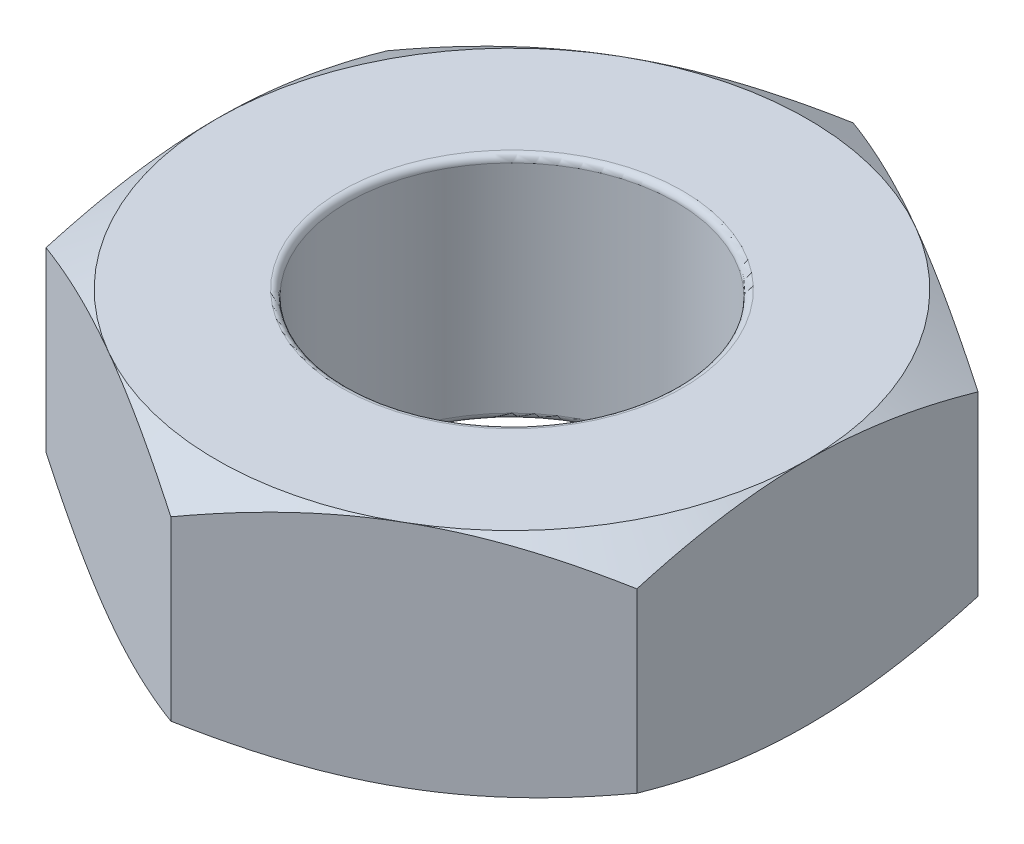
ISO-10303-21;
HEADER;
FILE_DESCRIPTION(('STEP AP214'),'2;1');
FILE_NAME('part.step','',(''),(''),'','','');
FILE_SCHEMA(('AUTOMOTIVE_DESIGN { 1 0 10303 214 1 1 1 1 }'));
ENDSEC;
DATA;
#1=APPLICATION_CONTEXT('core data for automotive mechanical design processes');
#2=APPLICATION_PROTOCOL_DEFINITION('international standard','automotive_design',2000,#1);
#3=PRODUCT_CONTEXT('',#1,'mechanical');
#4=PRODUCT('Part','Part','',(#3));
#5=PRODUCT_RELATED_PRODUCT_CATEGORY('part','',(#4));
#6=PRODUCT_DEFINITION_FORMATION('','',#4);
#7=PRODUCT_DEFINITION_CONTEXT('part definition',#1,'design');
#8=PRODUCT_DEFINITION('design','',#6,#7);
#9=PRODUCT_DEFINITION_SHAPE('','',#8);
#10=(LENGTH_UNIT() NAMED_UNIT(*) SI_UNIT(.MILLI.,.METRE.));
#11=(NAMED_UNIT(*) PLANE_ANGLE_UNIT() SI_UNIT($,.RADIAN.));
#12=(NAMED_UNIT(*) SI_UNIT($,.STERADIAN.) SOLID_ANGLE_UNIT());
#13=UNCERTAINTY_MEASURE_WITH_UNIT(LENGTH_MEASURE(1.E-05),#10,'distance_accuracy_value','');
#14=(GEOMETRIC_REPRESENTATION_CONTEXT(3) GLOBAL_UNCERTAINTY_ASSIGNED_CONTEXT((#13)) GLOBAL_UNIT_ASSIGNED_CONTEXT((#10,
#11,#12)) REPRESENTATION_CONTEXT('',''));
#15=CARTESIAN_POINT('',(0.,0.,0.));
#16=DIRECTION('',(0.,0.,1.));
#17=DIRECTION('',(1.,0.,0.));
#18=AXIS2_PLACEMENT_3D('',#15,#16,#17);
#19=CARTESIAN_POINT('',(2.25,1.75,-1.29903810567666));
#20=DIRECTION('',(-0.5,0.,0.866025403784439));
#21=DIRECTION('',(0.866025403784439,0.,0.5));
#22=AXIS2_PLACEMENT_3D('',#19,#20,#21);
#23=PLANE('',#22);
#24=CARTESIAN_POINT('',(-0.000200000000000445,0.201028565434254,-2.59819168140715));
#25=CARTESIAN_POINT('',(0.0986772488143566,0.168055578047864,-2.54110487518745));
#26=CARTESIAN_POINT('',(0.198407997179093,0.138067535415598,-2.48352530077259));
#27=CARTESIAN_POINT('',(0.399596540220632,0.0857223882308776,-2.36736904128969));
#28=CARTESIAN_POINT('',(0.501057910502945,0.0633838027064783,-2.30879029184485));
#29=CARTESIAN_POINT('',(0.702723189801078,0.0286095576734186,-2.19235878855587));
#30=CARTESIAN_POINT('',(0.802896064976671,0.0159424738337182,-2.13452395210774));
#31=CARTESIAN_POINT('',(1.00371331260268,0.00081890741741877,-2.01858206013295));
#32=CARTESIAN_POINT('',(1.1043569548332,-0.00165009697600177,-1.96047542619893));
#33=CARTESIAN_POINT('',(1.29242516452656,0.00347837463602896,-1.85189419470646));
#34=CARTESIAN_POINT('',(1.37987784389126,0.00981663451512003,-1.8014033667339));
#35=CARTESIAN_POINT('',(1.55421343210877,0.0299076571898887,-1.70075066794718));
#36=CARTESIAN_POINT('',(1.64109573768829,0.0436672872310832,-1.65058914543304));
#37=CARTESIAN_POINT('',(1.81579095410173,0.078066265350665,-1.54972881521059));
#38=CARTESIAN_POINT('',(1.90358174743525,0.0988514715826551,-1.49904277704711));
#39=CARTESIAN_POINT('',(2.07785373687759,0.146026087362979,-1.39842679703037));
#40=CARTESIAN_POINT('',(2.164337166751,0.172404408014301,-1.34849556551251));
#41=CARTESIAN_POINT('',(2.2502,0.201028565434254,-1.29892263562282));
#42=B_SPLINE_CURVE_WITH_KNOTS('',3,(#24,#25,#26,#27,#28,#29,#30,#31,#32,#33,#34,#35,#36,#37,#38,
#39,#40,#41),.UNSPECIFIED.,.F.,.F.,(4,2,2,2,2,2,2,2,4),(0.,0.356658826016552,0.714175103224236,
1.06284241804968,1.41108149062515,1.71433394539793,2.01786749258222,2.32813511279245,
2.63779325460359),.UNSPECIFIED.);
#43=CARTESIAN_POINT('',(0.,0.200961894323341,-2.59807621135332));
#44=VERTEX_POINT('',#43);
#45=CARTESIAN_POINT('',(1.125,0.,-1.94855715851499));
#46=VERTEX_POINT('',#45);
#47=EDGE_CURVE('E63',#44,#46,#42,.T.);
#48=ORIENTED_EDGE('',*,*,#47,.F.);
#49=DIRECTION('',(0.,-1.,0.));
#50=VECTOR('',#49,1.);
#51=CARTESIAN_POINT('',(0.,1.75,-2.59807621135332));
#52=LINE('',#51,#50);
#53=CARTESIAN_POINT('',(0.,1.54903810567666,-2.59807621135332));
#54=VERTEX_POINT('',#53);
#55=EDGE_CURVE('E346',#54,#44,#52,.T.);
#56=ORIENTED_EDGE('',*,*,#55,.F.);
#57=CARTESIAN_POINT('',(2.2502,1.54897143456575,-1.29892263562282));
#58=CARTESIAN_POINT('',(2.15132275118564,1.58194442195214,-1.35600944184252));
#59=CARTESIAN_POINT('',(2.0515920028209,1.6119324645844,-1.41358901625738));
#60=CARTESIAN_POINT('',(1.85040345977937,1.66427761176912,-1.52974527574028));
#61=CARTESIAN_POINT('',(1.74894208949705,1.68661619729352,-1.58832402518513));
#62=CARTESIAN_POINT('',(1.54727681019892,1.72139044232658,-1.7047555284741));
#63=CARTESIAN_POINT('',(1.44710393502333,1.73405752616628,-1.76259036492223));
#64=CARTESIAN_POINT('',(1.24628668739732,1.74918109258258,-1.87853225689703));
#65=CARTESIAN_POINT('',(1.1456430451668,1.751650096976,-1.93663889083104));
#66=CARTESIAN_POINT('',(0.957574835473434,1.74652162536397,-2.04522012232352));
#67=CARTESIAN_POINT('',(0.87012215610874,1.74018336548488,-2.09571095029608));
#68=CARTESIAN_POINT('',(0.695786567891225,1.72009234281011,-2.19636364908279));
#69=CARTESIAN_POINT('',(0.608904262311711,1.70633271276892,-2.24652517159694));
#70=CARTESIAN_POINT('',(0.434209045898263,1.67193373464933,-2.34738550181938));
#71=CARTESIAN_POINT('',(0.346418252564746,1.65114852841734,-2.39807153998286));
#72=CARTESIAN_POINT('',(0.172146263122404,1.60397391263702,-2.49868751999961));
#73=CARTESIAN_POINT('',(0.085662833248997,1.5775955919857,-2.54861875151746));
#74=CARTESIAN_POINT('',(-0.00020000000000065,1.54897143456575,-2.59819168140715));
#75=B_SPLINE_CURVE_WITH_KNOTS('',3,(#57,#58,#59,#60,#61,#62,#63,#64,#65,#66,#67,#68,#69,#70,#71,
#72,#73,#74),.UNSPECIFIED.,.F.,.F.,(4,2,2,2,2,2,2,2,4),(0.,0.356658826016552,0.714175103224236,
1.06284241804968,1.41108149062516,1.71433394539794,2.01786749258222,2.32813511279245,
2.63779325460359),.UNSPECIFIED.);
#76=CARTESIAN_POINT('',(1.125,1.75,-1.94855715851499));
#77=VERTEX_POINT('',#76);
#78=EDGE_CURVE('E278',#77,#54,#75,.T.);
#79=ORIENTED_EDGE('',*,*,#78,.F.);
#80=CARTESIAN_POINT('',(2.25,1.54903810567667,-1.29903810567667));
#81=VERTEX_POINT('',#80);
#82=EDGE_CURVE('E365',#81,#77,#75,.T.);
#83=ORIENTED_EDGE('',*,*,#82,.F.);
#84=DIRECTION('',(0.,-1.,0.));
#85=VECTOR('',#84,1.);
#86=CARTESIAN_POINT('',(2.25,1.75,-1.29903810567666));
#87=LINE('',#86,#85);
#88=CARTESIAN_POINT('',(2.25,0.200961894323341,-1.29903810567666));
#89=VERTEX_POINT('',#88);
#90=EDGE_CURVE('E362',#81,#89,#87,.T.);
#91=ORIENTED_EDGE('',*,*,#90,.T.);
#92=EDGE_CURVE('E151',#46,#89,#42,.T.);
#93=ORIENTED_EDGE('',*,*,#92,.F.);
#94=EDGE_LOOP('',(#48,#56,#79,#83,#91,#93));
#95=FACE_BOUND('',#94,.T.);
#96=ADVANCED_FACE('F47',(#95),#23,.F.);
#97=CARTESIAN_POINT('',(0.,1.75,-2.59807621135332));
#98=DIRECTION('',(0.5,0.,0.866025403784439));
#99=DIRECTION('',(0.866025403784439,0.,-0.5));
#100=AXIS2_PLACEMENT_3D('',#97,#98,#99);
#101=PLANE('',#100);
#102=CARTESIAN_POINT('',(-2.2502,0.201028565434254,-1.29892263562282));
#103=CARTESIAN_POINT('',(-2.15132275118564,0.168055578047864,-1.35600944184252));
#104=CARTESIAN_POINT('',(-2.05159200282091,0.138067535415598,-1.41358901625738));
#105=CARTESIAN_POINT('',(-1.85040345977937,0.0857223882308778,-1.52974527574028));
#106=CARTESIAN_POINT('',(-1.74894208949705,0.0633838027064785,-1.58832402518512));
#107=CARTESIAN_POINT('',(-1.54727681019892,0.0286095576734186,-1.7047555284741));
#108=CARTESIAN_POINT('',(-1.44710393502333,0.0159424738337181,-1.76259036492223));
#109=CARTESIAN_POINT('',(-1.24628668739732,0.00081890741741863,-1.87853225689702));
#110=CARTESIAN_POINT('',(-1.1456430451668,-0.00165009697600174,-1.93663889083104));
#111=CARTESIAN_POINT('',(-0.957574835473435,0.00347837463602905,-2.04522012232352));
#112=CARTESIAN_POINT('',(-0.870122156108742,0.00981663451512006,-2.09571095029608));
#113=CARTESIAN_POINT('',(-0.695786567891226,0.0299076571898888,-2.19636364908279));
#114=CARTESIAN_POINT('',(-0.608904262311712,0.0436672872310833,-2.24652517159694));
#115=CARTESIAN_POINT('',(-0.434209045898264,0.0780662653506652,-2.34738550181938));
#116=CARTESIAN_POINT('',(-0.346418252564747,0.0988514715826553,-2.39807153998286));
#117=CARTESIAN_POINT('',(-0.172146263122405,0.146026087362979,-2.49868751999961));
#118=CARTESIAN_POINT('',(-0.0856628332489981,0.172404408014302,-2.54861875151746));
#119=CARTESIAN_POINT('',(0.00019999999999954,0.201028565434254,-2.59819168140715));
#120=B_SPLINE_CURVE_WITH_KNOTS('',3,(#102,#103,#104,#105,#106,#107,#108,#109,#110,#111,#112,
#113,#114,#115,#116,#117,#118,#119),.UNSPECIFIED.,.F.,.F.,(4,2,2,2,2,2,2,2,4),(0.,
0.356658826016552,0.714175103224236,1.06284241804968,1.41108149062516,1.71433394539794,
2.01786749258222,2.32813511279245,2.63779325460359),.UNSPECIFIED.);
#121=CARTESIAN_POINT('',(-2.25,0.200961894323341,-1.29903810567666));
#122=VERTEX_POINT('',#121);
#123=CARTESIAN_POINT('',(-1.125,0.,-1.94855715851499));
#124=VERTEX_POINT('',#123);
#125=EDGE_CURVE('E71',#122,#124,#120,.T.);
#126=ORIENTED_EDGE('',*,*,#125,.F.);
#127=DIRECTION('',(0.,-1.,0.));
#128=VECTOR('',#127,1.);
#129=CARTESIAN_POINT('',(-2.25,1.75,-1.29903810567666));
#130=LINE('',#129,#128);
#131=CARTESIAN_POINT('',(-2.25,1.54903810567666,-1.29903810567666));
#132=VERTEX_POINT('',#131);
#133=EDGE_CURVE('E350',#132,#122,#130,.T.);
#134=ORIENTED_EDGE('',*,*,#133,.F.);
#135=CARTESIAN_POINT('',(0.0001999999999996,1.54897143456575,-2.59819168140715));
#136=CARTESIAN_POINT('',(-0.0986772488143576,1.58194442195214,-2.54110487518745));
#137=CARTESIAN_POINT('',(-0.198407997179094,1.6119324645844,-2.48352530077259));
#138=CARTESIAN_POINT('',(-0.399596540220633,1.66427761176912,-2.36736904128969));
#139=CARTESIAN_POINT('',(-0.501057910502946,1.68661619729352,-2.30879029184485));
#140=CARTESIAN_POINT('',(-0.702723189801079,1.72139044232658,-2.19235878855587));
#141=CARTESIAN_POINT('',(-0.802896064976672,1.73405752616628,-2.13452395210774));
#142=CARTESIAN_POINT('',(-1.00371331260268,1.74918109258258,-2.01858206013295));
#143=CARTESIAN_POINT('',(-1.1043569548332,1.751650096976,-1.96047542619893));
#144=CARTESIAN_POINT('',(-1.29242516452656,1.74652162536397,-1.85189419470646));
#145=CARTESIAN_POINT('',(-1.37987784389126,1.74018336548488,-1.8014033667339));
#146=CARTESIAN_POINT('',(-1.55421343210877,1.72009234281011,-1.70075066794718));
#147=CARTESIAN_POINT('',(-1.64109573768829,1.70633271276892,-1.65058914543304));
#148=CARTESIAN_POINT('',(-1.81579095410174,1.67193373464933,-1.54972881521059));
#149=CARTESIAN_POINT('',(-1.90358174743525,1.65114852841734,-1.49904277704711));
#150=CARTESIAN_POINT('',(-2.0778537368776,1.60397391263702,-1.39842679703037));
#151=CARTESIAN_POINT('',(-2.164337166751,1.5775955919857,-1.34849556551251));
#152=CARTESIAN_POINT('',(-2.2502,1.54897143456575,-1.29892263562282));
#153=B_SPLINE_CURVE_WITH_KNOTS('',3,(#135,#136,#137,#138,#139,#140,#141,#142,#143,#144,#145,
#146,#147,#148,#149,#150,#151,#152),.UNSPECIFIED.,.F.,.F.,(4,2,2,2,2,2,2,2,4),(0.,
0.356658826016552,0.714175103224236,1.06284241804968,1.41108149062516,1.71433394539794,
2.01786749258222,2.32813511279245,2.63779325460359),.UNSPECIFIED.);
#154=CARTESIAN_POINT('',(-1.125,1.75,-1.94855715851499));
#155=VERTEX_POINT('',#154);
#156=EDGE_CURVE('E270',#155,#132,#153,.T.);
#157=ORIENTED_EDGE('',*,*,#156,.F.);
#158=EDGE_CURVE('E277',#54,#155,#153,.T.);
#159=ORIENTED_EDGE('',*,*,#158,.F.);
#160=ORIENTED_EDGE('',*,*,#55,.T.);
#161=EDGE_CURVE('E183',#124,#44,#120,.T.);
#162=ORIENTED_EDGE('',*,*,#161,.F.);
#163=EDGE_LOOP('',(#126,#134,#157,#159,#160,#162));
#164=FACE_BOUND('',#163,.T.);
#165=ADVANCED_FACE('F284',(#164),#101,.F.);
#166=CARTESIAN_POINT('',(-2.25,1.75,-1.29903810567666));
#167=DIRECTION('',(1.,0.,0.));
#168=DIRECTION('',(0.,0.,-1.));
#169=AXIS2_PLACEMENT_3D('',#166,#167,#168);
#170=PLANE('',#169);
#171=CARTESIAN_POINT('',(-2.25,1.57049861982334,4.43172912721208));
#172=CARTESIAN_POINT('',(-2.25,1.51735693759208,4.32848794492226));
#173=CARTESIAN_POINT('',(-2.25,1.46450484743296,4.22509639331572));
#174=CARTESIAN_POINT('',(-2.25,1.35952530789621,4.01794384416323));
#175=CARTESIAN_POINT('',(-2.25,1.30739787204856,3.91418283976455));
#176=CARTESIAN_POINT('',(-2.25,1.20393081844307,3.70605700815303));
#177=CARTESIAN_POINT('',(-2.25,1.1525926236047,3.60169147231438));
#178=CARTESIAN_POINT('',(-2.25,1.05099117669964,3.39243582155597));
#179=CARTESIAN_POINT('',(-2.25,1.000727939927,3.28754569919877));
#180=CARTESIAN_POINT('',(-2.25,0.898925995293034,3.07160047020285));
#181=CARTESIAN_POINT('',(-2.25,0.847459290612845,2.96051132352861));
#182=CARTESIAN_POINT('',(-2.25,0.746406212005017,2.73748183196732));
#183=CARTESIAN_POINT('',(-2.25,0.696819787356086,2.62554151013899));
#184=CARTESIAN_POINT('',(-2.25,0.600100967453588,2.40069008962636));
#185=CARTESIAN_POINT('',(-2.25,0.552966929054416,2.28777970157739));
#186=CARTESIAN_POINT('',(-2.25,0.461846511068629,2.06065851247683));
#187=CARTESIAN_POINT('',(-2.25,0.417860865336628,1.94644741538902));
#188=CARTESIAN_POINT('',(-2.25,0.32729368556671,1.69797138865069));
#189=CARTESIAN_POINT('',(-2.25,0.28143501613463,1.56343919862733));
#190=CARTESIAN_POINT('',(-2.25,0.197475070529799,1.29200018214826));
#191=CARTESIAN_POINT('',(-2.25,0.159369866726331,1.15509459630545));
#192=CARTESIAN_POINT('',(-2.25,0.0942889667848678,0.88136926939907));
#193=CARTESIAN_POINT('',(-2.25,0.06711404680851,0.744598126937421));
#194=CARTESIAN_POINT('',(-2.25,0.025722233099121,0.469086445681222));
#195=CARTESIAN_POINT('',(-2.25,0.0114977452462128,0.330347109575201));
#196=CARTESIAN_POINT('',(-2.25,0.00123269639131379,0.120784370517543));
#197=CARTESIAN_POINT('',(-2.25,-0.000315601094854461,0.0502039746349327));
#198=CARTESIAN_POINT('',(-2.25,0.000422033997697215,-0.0909367469657717));
#199=CARTESIAN_POINT('',(-2.25,0.0027079673021382,-0.161497072680064));
#200=CARTESIAN_POINT('',(-2.25,0.0152377813490387,-0.372864383623229));
#201=CARTESIAN_POINT('',(-2.25,0.031153514657774,-0.513361084144871));
#202=CARTESIAN_POINT('',(-2.25,0.0764279690031746,-0.79498241315873));
#203=CARTESIAN_POINT('',(-2.25,0.106052731323689,-0.936062007316041));
#204=CARTESIAN_POINT('',(-2.25,0.175669429631058,-1.21561548141805));
#205=CARTESIAN_POINT('',(-2.25,0.215664560549492,-1.35408854420889));
#206=CARTESIAN_POINT('',(-2.25,0.301433813240796,-1.62298376559588));
#207=CARTESIAN_POINT('',(-2.25,0.34690627294026,-1.75350414338493));
#208=CARTESIAN_POINT('',(-2.25,0.442941824020628,-2.01267340913791));
#209=CARTESIAN_POINT('',(-2.25,0.493506146306572,-2.14132183593333));
#210=CARTESIAN_POINT('',(-2.25,0.598415917250672,-2.3972089614727));
#211=CARTESIAN_POINT('',(-2.25,0.652765191067168,-2.5244460788882));
#212=CARTESIAN_POINT('',(-2.25,0.764244038829299,-2.77769813848635));
#213=CARTESIAN_POINT('',(-2.25,0.821373763792893,-2.9037130138371));
#214=CARTESIAN_POINT('',(-2.25,0.934436062749625,-3.1476496239965));
#215=CARTESIAN_POINT('',(-2.25,0.990252927298656,-3.26562520727676));
#216=CARTESIAN_POINT('',(-2.25,1.10334942732948,-3.50087634814471));
#217=CARTESIAN_POINT('',(-2.25,1.16062911044141,-3.61815188278466));
#218=CARTESIAN_POINT('',(-2.25,1.27615326827056,-3.85174791850405));
#219=CARTESIAN_POINT('',(-2.25,1.3343939714757,-3.96807028911018));
#220=CARTESIAN_POINT('',(-2.25,1.45180296105985,-4.20023381118101));
#221=CARTESIAN_POINT('',(-2.25,1.51097116762094,-4.31607500298083));
#222=CARTESIAN_POINT('',(-2.25,1.57049861982334,-4.43172912721207));
#223=B_SPLINE_CURVE_WITH_KNOTS('',3,(#171,#172,#173,#174,#175,#176,#177,#178,#179,#180,#181,
#182,#183,#184,#185,#186,#187,#188,#189,#190,#191,#192,#193,#194,#195,#196,#197,#198,#199,#200,
#201,#202,#203,#204,#205,#206,#207,#208,#209,#210,#211,#212,#213,#214,#215,#216,#217,#218,#219,
#220,#221,#222),.UNSPECIFIED.,.F.,.F.,(4,2,2,2,2,2,2,2,2,2,2,2,2,2,2,2,2,2,2,2,2,2,2,2,2,4),(0.,
0.348347395383933,0.696701286027882,1.04562309484171,1.39454986466947,1.76183249981756,
2.12910522031385,2.49612860556298,2.86323726307789,3.2894710608127,3.71548840311863,
4.13334452619794,4.55095546076511,4.7626532574073,4.97435109411843,5.39773666667532,
5.82970728415092,6.26181114277156,6.67631854142574,7.09092638459782,7.50595949709433,
7.9210151769911,8.31254332110152,8.70408422986847,9.09434358465051,9.4845695373743),.UNSPECIFIED.);
#224=CARTESIAN_POINT('',(-2.25,0.200961894323341,1.29903810567666));
#225=VERTEX_POINT('',#224);
#226=CARTESIAN_POINT('',(-2.25,0.,0.));
#227=VERTEX_POINT('',#226);
#228=EDGE_CURVE('E404',#225,#227,#223,.T.);
#229=ORIENTED_EDGE('',*,*,#228,.F.);
#230=DIRECTION('',(0.,-1.,0.));
#231=VECTOR('',#230,1.);
#232=CARTESIAN_POINT('',(-2.25,1.75,1.29903810567666));
#233=LINE('',#232,#231);
#234=CARTESIAN_POINT('',(-2.25,1.54903810567666,1.29903810567666));
#235=VERTEX_POINT('',#234);
#236=EDGE_CURVE('E354',#235,#225,#233,.T.);
#237=ORIENTED_EDGE('',*,*,#236,.F.);
#238=CARTESIAN_POINT('',(-2.25,0.17950138017666,-4.43172912721207));
#239=CARTESIAN_POINT('',(-2.25,0.232643062407915,-4.32848794492226));
#240=CARTESIAN_POINT('',(-2.25,0.285495152567039,-4.22509639331572));
#241=CARTESIAN_POINT('',(-2.25,0.390474692103788,-4.01794384416323));
#242=CARTESIAN_POINT('',(-2.25,0.442602127951439,-3.91418283976455));
#243=CARTESIAN_POINT('',(-2.25,0.546069181556929,-3.70605700815303));
#244=CARTESIAN_POINT('',(-2.25,0.597407376395303,-3.60169147231438));
#245=CARTESIAN_POINT('',(-2.25,0.699008823300362,-3.39243582155596));
#246=CARTESIAN_POINT('',(-2.25,0.749272060072999,-3.28754569919877));
#247=CARTESIAN_POINT('',(-2.25,0.851074004706966,-3.07160047020285));
#248=CARTESIAN_POINT('',(-2.25,0.902540709387155,-2.96051132352861));
#249=CARTESIAN_POINT('',(-2.25,1.00359378799498,-2.73748183196732));
#250=CARTESIAN_POINT('',(-2.25,1.05318021264391,-2.62554151013899));
#251=CARTESIAN_POINT('',(-2.25,1.14989903254641,-2.40069008962636));
#252=CARTESIAN_POINT('',(-2.25,1.19703307094558,-2.28777970157739));
#253=CARTESIAN_POINT('',(-2.25,1.28815348893137,-2.06065851247683));
#254=CARTESIAN_POINT('',(-2.25,1.33213913466337,-1.94644741538902));
#255=CARTESIAN_POINT('',(-2.25,1.42270631443329,-1.69797138865069));
#256=CARTESIAN_POINT('',(-2.25,1.46856498386537,-1.56343919862733));
#257=CARTESIAN_POINT('',(-2.25,1.5525249294702,-1.29200018214826));
#258=CARTESIAN_POINT('',(-2.25,1.59063013327367,-1.15509459630545));
#259=CARTESIAN_POINT('',(-2.25,1.65571103321513,-0.881369269399069));
#260=CARTESIAN_POINT('',(-2.25,1.68288595319149,-0.744598126937421));
#261=CARTESIAN_POINT('',(-2.25,1.72427776690088,-0.469086445681221));
#262=CARTESIAN_POINT('',(-2.25,1.73850225475379,-0.3303471095752));
#263=CARTESIAN_POINT('',(-2.25,1.74876730360869,-0.120784370517542));
#264=CARTESIAN_POINT('',(-2.25,1.75031560109485,-0.0502039746349316));
#265=CARTESIAN_POINT('',(-2.25,1.7495779660023,0.0909367469657728));
#266=CARTESIAN_POINT('',(-2.25,1.74729203269786,0.161497072680065));
#267=CARTESIAN_POINT('',(-2.25,1.73476221865096,0.37286438362323));
#268=CARTESIAN_POINT('',(-2.25,1.71884648534223,0.513361084144872));
#269=CARTESIAN_POINT('',(-2.25,1.67357203099683,0.794982413158731));
#270=CARTESIAN_POINT('',(-2.25,1.64394726867631,0.936062007316042));
#271=CARTESIAN_POINT('',(-2.25,1.57433057036894,1.21561548141805));
#272=CARTESIAN_POINT('',(-2.25,1.53433543945051,1.35408854420889));
#273=CARTESIAN_POINT('',(-2.25,1.4485661867592,1.62298376559588));
#274=CARTESIAN_POINT('',(-2.25,1.40309372705974,1.75350414338493));
#275=CARTESIAN_POINT('',(-2.25,1.30705817597937,2.01267340913791));
#276=CARTESIAN_POINT('',(-2.25,1.25649385369343,2.14132183593333));
#277=CARTESIAN_POINT('',(-2.25,1.15158408274933,2.3972089614727));
#278=CARTESIAN_POINT('',(-2.25,1.09723480893283,2.5244460788882));
#279=CARTESIAN_POINT('',(-2.25,0.985755961170701,2.77769813848635));
#280=CARTESIAN_POINT('',(-2.25,0.928626236207106,2.9037130138371));
#281=CARTESIAN_POINT('',(-2.25,0.815563937250375,3.1476496239965));
#282=CARTESIAN_POINT('',(-2.25,0.759747072701344,3.26562520727676));
#283=CARTESIAN_POINT('',(-2.25,0.646650572670523,3.50087634814471));
#284=CARTESIAN_POINT('',(-2.25,0.589370889558593,3.61815188278466));
#285=CARTESIAN_POINT('',(-2.25,0.473846731729442,3.85174791850405));
#286=CARTESIAN_POINT('',(-2.25,0.4156060285243,3.96807028911018));
#287=CARTESIAN_POINT('',(-2.25,0.298197038940152,4.20023381118101));
#288=CARTESIAN_POINT('',(-2.25,0.239028832379063,4.31607500298083));
#289=CARTESIAN_POINT('',(-2.25,0.17950138017666,4.43172912721208));
#290=B_SPLINE_CURVE_WITH_KNOTS('',3,(#238,#239,#240,#241,#242,#243,#244,#245,#246,#247,#248,
#249,#250,#251,#252,#253,#254,#255,#256,#257,#258,#259,#260,#261,#262,#263,#264,#265,#266,#267,
#268,#269,#270,#271,#272,#273,#274,#275,#276,#277,#278,#279,#280,#281,#282,#283,#284,#285,#286,
#287,#288,#289),.UNSPECIFIED.,.F.,.F.,(4,2,2,2,2,2,2,2,2,2,2,2,2,2,2,2,2,2,2,2,2,2,2,2,2,4),(0.,
0.348347395383933,0.696701286027883,1.04562309484171,1.39454986466947,1.76183249981756,
2.12910522031385,2.49612860556298,2.86323726307789,3.2894710608127,3.71548840311863,
4.13334452619793,4.55095546076511,4.7626532574073,4.97435109411843,5.39773666667532,
5.82970728415092,6.26181114277156,6.67631854142574,7.09092638459782,7.50595949709433,
7.9210151769911,8.31254332110152,8.70408422986846,9.0943435846505,9.4845695373743),.UNSPECIFIED.);
#291=CARTESIAN_POINT('',(-2.25,1.75,0.));
#292=VERTEX_POINT('',#291);
#293=EDGE_CURVE('E262',#292,#235,#290,.T.);
#294=ORIENTED_EDGE('',*,*,#293,.F.);
#295=EDGE_CURVE('E269',#132,#292,#290,.T.);
#296=ORIENTED_EDGE('',*,*,#295,.F.);
#297=ORIENTED_EDGE('',*,*,#133,.T.);
#298=EDGE_CURVE('E219',#227,#122,#223,.T.);
#299=ORIENTED_EDGE('',*,*,#298,.F.);
#300=EDGE_LOOP('',(#229,#237,#294,#296,#297,#299));
#301=FACE_BOUND('',#300,.T.);
#302=ADVANCED_FACE('F242',(#301),#170,.F.);
#303=CARTESIAN_POINT('',(-2.25,1.75,1.29903810567666));
#304=DIRECTION('',(0.5,0.,-0.866025403784439));
#305=DIRECTION('',(-0.866025403784439,0.,-0.5));
#306=AXIS2_PLACEMENT_3D('',#303,#304,#305);
#307=PLANE('',#306);
#308=CARTESIAN_POINT('',(0.000200000000000442,0.201028565434254,2.59819168140715));
#309=CARTESIAN_POINT('',(-0.0986772488143569,0.168055578047864,2.54110487518745));
#310=CARTESIAN_POINT('',(-0.198407997179093,0.138067535415598,2.48352530077259));
#311=CARTESIAN_POINT('',(-0.399596540220632,0.0857223882308776,2.36736904128969));
#312=CARTESIAN_POINT('',(-0.501057910502945,0.0633838027064783,2.30879029184485));
#313=CARTESIAN_POINT('',(-0.702723189801078,0.0286095576734186,2.19235878855587));
#314=CARTESIAN_POINT('',(-0.802896064976671,0.0159424738337183,2.13452395210774));
#315=CARTESIAN_POINT('',(-1.00371331260268,0.000818907417418824,2.01858206013295));
#316=CARTESIAN_POINT('',(-1.1043569548332,-0.00165009697600175,1.96047542619893));
#317=CARTESIAN_POINT('',(-1.29242516452656,0.00347837463602894,1.85189419470646));
#318=CARTESIAN_POINT('',(-1.37987784389126,0.00981663451512002,1.8014033667339));
#319=CARTESIAN_POINT('',(-1.55421343210877,0.0299076571898888,1.70075066794718));
#320=CARTESIAN_POINT('',(-1.64109573768829,0.0436672872310834,1.65058914543304));
#321=CARTESIAN_POINT('',(-1.81579095410174,0.0780662653506652,1.54972881521059));
#322=CARTESIAN_POINT('',(-1.90358174743525,0.0988514715826552,1.49904277704711));
#323=CARTESIAN_POINT('',(-2.07785373687759,0.146026087362979,1.39842679703037));
#324=CARTESIAN_POINT('',(-2.164337166751,0.172404408014302,1.34849556551251));
#325=CARTESIAN_POINT('',(-2.2502,0.201028565434254,1.29892263562282));
#326=B_SPLINE_CURVE_WITH_KNOTS('',3,(#308,#309,#310,#311,#312,#313,#314,#315,#316,#317,#318,
#319,#320,#321,#322,#323,#324,#325),.UNSPECIFIED.,.F.,.F.,(4,2,2,2,2,2,2,2,4),(0.,
0.356658826016552,0.714175103224236,1.06284241804968,1.41108149062516,1.71433394539794,
2.01786749258222,2.32813511279245,2.63779325460359),.UNSPECIFIED.);
#327=CARTESIAN_POINT('',(0.,0.200961894323341,2.59807621135332));
#328=VERTEX_POINT('',#327);
#329=CARTESIAN_POINT('',(-1.125,0.,1.94855715851499));
#330=VERTEX_POINT('',#329);
#331=EDGE_CURVE('E161',#328,#330,#326,.T.);
#332=ORIENTED_EDGE('',*,*,#331,.F.);
#333=DIRECTION('',(0.,-1.,0.));
#334=VECTOR('',#333,1.);
#335=CARTESIAN_POINT('',(0.,1.75,2.59807621135332));
#336=LINE('',#335,#334);
#337=CARTESIAN_POINT('',(0.,1.54903810567666,2.59807621135332));
#338=VERTEX_POINT('',#337);
#339=EDGE_CURVE('E179',#338,#328,#336,.T.);
#340=ORIENTED_EDGE('',*,*,#339,.F.);
#341=CARTESIAN_POINT('',(-2.2502,1.54897143456575,1.29892263562282));
#342=CARTESIAN_POINT('',(-2.15132275118564,1.58194442195214,1.35600944184252));
#343=CARTESIAN_POINT('',(-2.05159200282091,1.6119324645844,1.41358901625738));
#344=CARTESIAN_POINT('',(-1.85040345977937,1.66427761176912,1.52974527574028));
#345=CARTESIAN_POINT('',(-1.74894208949705,1.68661619729352,1.58832402518513));
#346=CARTESIAN_POINT('',(-1.54727681019892,1.72139044232658,1.7047555284741));
#347=CARTESIAN_POINT('',(-1.44710393502333,1.73405752616628,1.76259036492223));
#348=CARTESIAN_POINT('',(-1.24628668739732,1.74918109258258,1.87853225689703));
#349=CARTESIAN_POINT('',(-1.1456430451668,1.751650096976,1.93663889083104));
#350=CARTESIAN_POINT('',(-0.957574835473434,1.74652162536397,2.04522012232352));
#351=CARTESIAN_POINT('',(-0.870122156108741,1.74018336548488,2.09571095029608));
#352=CARTESIAN_POINT('',(-0.695786567891225,1.72009234281011,2.19636364908279));
#353=CARTESIAN_POINT('',(-0.608904262311711,1.70633271276892,2.24652517159694));
#354=CARTESIAN_POINT('',(-0.434209045898264,1.67193373464933,2.34738550181938));
#355=CARTESIAN_POINT('',(-0.346418252564746,1.65114852841734,2.39807153998286));
#356=CARTESIAN_POINT('',(-0.172146263122405,1.60397391263702,2.49868751999961));
#357=CARTESIAN_POINT('',(-0.0856628332489974,1.5775955919857,2.54861875151746));
#358=CARTESIAN_POINT('',(0.000200000000000347,1.54897143456575,2.59819168140715));
#359=B_SPLINE_CURVE_WITH_KNOTS('',3,(#341,#342,#343,#344,#345,#346,#347,#348,#349,#350,#351,
#352,#353,#354,#355,#356,#357,#358),.UNSPECIFIED.,.F.,.F.,(4,2,2,2,2,2,2,2,4),(0.,
0.356658826016552,0.714175103224236,1.06284241804968,1.41108149062516,1.71433394539794,
2.01786749258222,2.32813511279245,2.63779325460359),.UNSPECIFIED.);
#360=CARTESIAN_POINT('',(-1.125,1.75,1.94855715851499));
#361=VERTEX_POINT('',#360);
#362=EDGE_CURVE('E247',#361,#338,#359,.T.);
#363=ORIENTED_EDGE('',*,*,#362,.F.);
#364=EDGE_CURVE('E255',#235,#361,#359,.T.);
#365=ORIENTED_EDGE('',*,*,#364,.F.);
#366=ORIENTED_EDGE('',*,*,#236,.T.);
#367=EDGE_CURVE('E185',#330,#225,#326,.T.);
#368=ORIENTED_EDGE('',*,*,#367,.F.);
#369=EDGE_LOOP('',(#332,#340,#363,#365,#366,#368));
#370=FACE_BOUND('',#369,.T.);
#371=ADVANCED_FACE('F239',(#370),#307,.F.);
#372=CARTESIAN_POINT('',(0.,1.75,2.59807621135332));
#373=DIRECTION('',(-0.5,0.,-0.866025403784439));
#374=DIRECTION('',(-0.866025403784439,0.,0.5));
#375=AXIS2_PLACEMENT_3D('',#372,#373,#374);
#376=PLANE('',#375);
#377=CARTESIAN_POINT('',(2.2502,0.201028565434254,1.29892263562282));
#378=CARTESIAN_POINT('',(2.15132275118564,0.168055578047863,1.35600944184252));
#379=CARTESIAN_POINT('',(2.05159200282091,0.138067535415598,1.41358901625738));
#380=CARTESIAN_POINT('',(1.85040345977937,0.0857223882308776,1.52974527574028));
#381=CARTESIAN_POINT('',(1.74894208949705,0.0633838027064784,1.58832402518512));
#382=CARTESIAN_POINT('',(1.54727681019892,0.0286095576734186,1.7047555284741));
#383=CARTESIAN_POINT('',(1.44710393502333,0.015942473833718,1.76259036492223));
#384=CARTESIAN_POINT('',(1.24628668739732,0.000818907417418589,1.87853225689702));
#385=CARTESIAN_POINT('',(1.1456430451668,-0.00165009697600173,1.93663889083104));
#386=CARTESIAN_POINT('',(0.957574835473435,0.00347837463602916,2.04522012232352));
#387=CARTESIAN_POINT('',(0.870122156108742,0.0098166345151202,2.09571095029608));
#388=CARTESIAN_POINT('',(0.695786567891226,0.0299076571898889,2.19636364908279));
#389=CARTESIAN_POINT('',(0.608904262311712,0.0436672872310833,2.24652517159694));
#390=CARTESIAN_POINT('',(0.434209045898264,0.0780662653506652,2.34738550181938));
#391=CARTESIAN_POINT('',(0.346418252564747,0.0988514715826553,2.39807153998286));
#392=CARTESIAN_POINT('',(0.172146263122405,0.146026087362979,2.49868751999961));
#393=CARTESIAN_POINT('',(0.0856628332489978,0.172404408014302,2.54861875151746));
#394=CARTESIAN_POINT('',(-0.000199999999999652,0.201028565434254,2.59819168140715));
#395=B_SPLINE_CURVE_WITH_KNOTS('',3,(#377,#378,#379,#380,#381,#382,#383,#384,#385,#386,#387,
#388,#389,#390,#391,#392,#393,#394),.UNSPECIFIED.,.F.,.F.,(4,2,2,2,2,2,2,2,4),(0.,
0.356658826016552,0.714175103224236,1.06284241804968,1.41108149062516,1.71433394539794,
2.01786749258222,2.32813511279245,2.63779325460359),.UNSPECIFIED.);
#396=CARTESIAN_POINT('',(2.25,0.200961894323335,1.29903810567667));
#397=VERTEX_POINT('',#396);
#398=CARTESIAN_POINT('',(1.125,0.,1.94855715851499));
#399=VERTEX_POINT('',#398);
#400=EDGE_CURVE('E138',#397,#399,#395,.T.);
#401=ORIENTED_EDGE('',*,*,#400,.F.);
#402=DIRECTION('',(0.,-1.,0.));
#403=VECTOR('',#402,1.);
#404=CARTESIAN_POINT('',(2.25,1.75,1.29903810567666));
#405=LINE('',#404,#403);
#406=CARTESIAN_POINT('',(2.25,1.54903810567666,1.29903810567666));
#407=VERTEX_POINT('',#406);
#408=EDGE_CURVE('E360',#407,#397,#405,.T.);
#409=ORIENTED_EDGE('',*,*,#408,.F.);
#410=CARTESIAN_POINT('',(-0.000199999999999603,1.54897143456575,2.59819168140715));
#411=CARTESIAN_POINT('',(0.0986772488143578,1.58194442195214,2.54110487518745));
#412=CARTESIAN_POINT('',(0.198407997179094,1.6119324645844,2.48352530077259));
#413=CARTESIAN_POINT('',(0.399596540220633,1.66427761176912,2.36736904128969));
#414=CARTESIAN_POINT('',(0.501057910502946,1.68661619729352,2.30879029184485));
#415=CARTESIAN_POINT('',(0.702723189801079,1.72139044232658,2.19235878855587));
#416=CARTESIAN_POINT('',(0.802896064976672,1.73405752616628,2.13452395210774));
#417=CARTESIAN_POINT('',(1.00371331260268,1.74918109258258,2.01858206013295));
#418=CARTESIAN_POINT('',(1.1043569548332,1.751650096976,1.96047542619893));
#419=CARTESIAN_POINT('',(1.29242516452656,1.74652162536397,1.85189419470646));
#420=CARTESIAN_POINT('',(1.37987784389126,1.74018336548488,1.8014033667339));
#421=CARTESIAN_POINT('',(1.55421343210877,1.72009234281011,1.70075066794718));
#422=CARTESIAN_POINT('',(1.64109573768829,1.70633271276892,1.65058914543304));
#423=CARTESIAN_POINT('',(1.81579095410174,1.67193373464933,1.54972881521059));
#424=CARTESIAN_POINT('',(1.90358174743525,1.65114852841734,1.49904277704711));
#425=CARTESIAN_POINT('',(2.07785373687759,1.60397391263702,1.39842679703037));
#426=CARTESIAN_POINT('',(2.164337166751,1.5775955919857,1.34849556551251));
#427=CARTESIAN_POINT('',(2.2502,1.54897143456575,1.29892263562282));
#428=B_SPLINE_CURVE_WITH_KNOTS('',3,(#410,#411,#412,#413,#414,#415,#416,#417,#418,#419,#420,
#421,#422,#423,#424,#425,#426,#427),.UNSPECIFIED.,.F.,.F.,(4,2,2,2,2,2,2,2,4),(0.,
0.356658826016552,0.714175103224236,1.06284241804968,1.41108149062516,1.71433394539794,
2.01786749258222,2.32813511279245,2.63779325460359),.UNSPECIFIED.);
#429=CARTESIAN_POINT('',(1.125,1.75,1.94855715851499));
#430=VERTEX_POINT('',#429);
#431=EDGE_CURVE('E257',#430,#407,#428,.T.);
#432=ORIENTED_EDGE('',*,*,#431,.F.);
#433=EDGE_CURVE('E256',#338,#430,#428,.T.);
#434=ORIENTED_EDGE('',*,*,#433,.F.);
#435=ORIENTED_EDGE('',*,*,#339,.T.);
#436=EDGE_CURVE('E154',#399,#328,#395,.T.);
#437=ORIENTED_EDGE('',*,*,#436,.F.);
#438=EDGE_LOOP('',(#401,#409,#432,#434,#435,#437));
#439=FACE_BOUND('',#438,.T.);
#440=ADVANCED_FACE('F176',(#439),#376,.F.);
#441=CARTESIAN_POINT('',(2.25,1.75,1.29903810567666));
#442=DIRECTION('',(-1.,0.,0.));
#443=DIRECTION('',(0.,0.,1.));
#444=AXIS2_PLACEMENT_3D('',#441,#442,#443);
#445=PLANE('',#444);
#446=CARTESIAN_POINT('',(2.25,1.57049861982334,-4.43172912721208));
#447=CARTESIAN_POINT('',(2.25,1.51735693759208,-4.32848794492226));
#448=CARTESIAN_POINT('',(2.25,1.46450484743296,-4.22509639331572));
#449=CARTESIAN_POINT('',(2.25,1.35952530789621,-4.01794384416323));
#450=CARTESIAN_POINT('',(2.25,1.30739787204856,-3.91418283976455));
#451=CARTESIAN_POINT('',(2.25,1.20393081844307,-3.70605700815303));
#452=CARTESIAN_POINT('',(2.25,1.1525926236047,-3.60169147231438));
#453=CARTESIAN_POINT('',(2.25,1.05099117669964,-3.39243582155597));
#454=CARTESIAN_POINT('',(2.25,1.000727939927,-3.28754569919877));
#455=CARTESIAN_POINT('',(2.25,0.898925995293034,-3.07160047020286));
#456=CARTESIAN_POINT('',(2.25,0.847459290612845,-2.96051132352861));
#457=CARTESIAN_POINT('',(2.25,0.746406212005017,-2.73748183196732));
#458=CARTESIAN_POINT('',(2.25,0.696819787356086,-2.62554151013899));
#459=CARTESIAN_POINT('',(2.25,0.600100967453588,-2.40069008962636));
#460=CARTESIAN_POINT('',(2.25,0.552966929054416,-2.28777970157739));
#461=CARTESIAN_POINT('',(2.25,0.461846511068629,-2.06065851247683));
#462=CARTESIAN_POINT('',(2.25,0.417860865336628,-1.94644741538902));
#463=CARTESIAN_POINT('',(2.25,0.32729368556671,-1.69797138865069));
#464=CARTESIAN_POINT('',(2.25,0.28143501613463,-1.56343919862733));
#465=CARTESIAN_POINT('',(2.25,0.197475070529799,-1.29200018214826));
#466=CARTESIAN_POINT('',(2.25,0.159369866726331,-1.15509459630545));
#467=CARTESIAN_POINT('',(2.25,0.0942889667848674,-0.881369269399071));
#468=CARTESIAN_POINT('',(2.25,0.0671140468085095,-0.744598126937423));
#469=CARTESIAN_POINT('',(2.25,0.0257222330991207,-0.469086445681223));
#470=CARTESIAN_POINT('',(2.25,0.0114977452462128,-0.330347109575203));
#471=CARTESIAN_POINT('',(2.25,0.0012326963913136,-0.120784370517545));
#472=CARTESIAN_POINT('',(2.25,-0.000315601094854779,-0.050203974634935));
#473=CARTESIAN_POINT('',(2.25,0.000422033997696789,0.0909367469657692));
#474=CARTESIAN_POINT('',(2.25,0.00270796730213784,0.161497072680062));
#475=CARTESIAN_POINT('',(2.25,0.0152377813490384,0.372864383623227));
#476=CARTESIAN_POINT('',(2.25,0.0311535146577735,0.513361084144869));
#477=CARTESIAN_POINT('',(2.25,0.0764279690031739,0.794982413158729));
#478=CARTESIAN_POINT('',(2.25,0.106052731323688,0.936062007316039));
#479=CARTESIAN_POINT('',(2.25,0.175669429631058,1.21561548141805));
#480=CARTESIAN_POINT('',(2.25,0.215664560549491,1.35408854420889));
#481=CARTESIAN_POINT('',(2.25,0.301433813240795,1.62298376559588));
#482=CARTESIAN_POINT('',(2.25,0.346906272940259,1.75350414338493));
#483=CARTESIAN_POINT('',(2.25,0.442941824020627,2.0126734091379));
#484=CARTESIAN_POINT('',(2.25,0.493506146306572,2.14132183593333));
#485=CARTESIAN_POINT('',(2.25,0.598415917250671,2.3972089614727));
#486=CARTESIAN_POINT('',(2.25,0.652765191067168,2.5244460788882));
#487=CARTESIAN_POINT('',(2.25,0.764244038829299,2.77769813848635));
#488=CARTESIAN_POINT('',(2.25,0.821373763792893,2.9037130138371));
#489=CARTESIAN_POINT('',(2.25,0.934436062749625,3.1476496239965));
#490=CARTESIAN_POINT('',(2.25,0.990252927298656,3.26562520727676));
#491=CARTESIAN_POINT('',(2.25,1.10334942732948,3.50087634814471));
#492=CARTESIAN_POINT('',(2.25,1.16062911044141,3.61815188278466));
#493=CARTESIAN_POINT('',(2.25,1.27615326827056,3.85174791850404));
#494=CARTESIAN_POINT('',(2.25,1.3343939714757,3.96807028911018));
#495=CARTESIAN_POINT('',(2.25,1.45180296105985,4.20023381118101));
#496=CARTESIAN_POINT('',(2.25,1.51097116762094,4.31607500298083));
#497=CARTESIAN_POINT('',(2.25,1.57049861982334,4.43172912721208));
#498=B_SPLINE_CURVE_WITH_KNOTS('',3,(#446,#447,#448,#449,#450,#451,#452,#453,#454,#455,#456,
#457,#458,#459,#460,#461,#462,#463,#464,#465,#466,#467,#468,#469,#470,#471,#472,#473,#474,#475,
#476,#477,#478,#479,#480,#481,#482,#483,#484,#485,#486,#487,#488,#489,#490,#491,#492,#493,#494,
#495,#496,#497),.UNSPECIFIED.,.F.,.F.,(4,2,2,2,2,2,2,2,2,2,2,2,2,2,2,2,2,2,2,2,2,2,2,2,2,4),(0.,
0.348347395383933,0.696701286027883,1.04562309484171,1.39454986466947,1.76183249981756,
2.12910522031385,2.49612860556298,2.86323726307789,3.2894710608127,3.71548840311863,
4.13334452619794,4.55095546076511,4.7626532574073,4.97435109411843,5.39773666667532,
5.82970728415092,6.26181114277156,6.67631854142574,7.09092638459783,7.50595949709433,
7.9210151769911,8.31254332110152,8.70408422986847,9.09434358465051,9.4845695373743),.UNSPECIFIED.);
#499=CARTESIAN_POINT('',(2.25,0.,0.));
#500=VERTEX_POINT('',#499);
#501=EDGE_CURVE('E152',#89,#500,#498,.T.);
#502=ORIENTED_EDGE('',*,*,#501,.F.);
#503=ORIENTED_EDGE('',*,*,#90,.F.);
#504=CARTESIAN_POINT('',(2.25,0.179501380176659,4.43172912721208));
#505=CARTESIAN_POINT('',(2.25,0.232643062407915,4.32848794492226));
#506=CARTESIAN_POINT('',(2.25,0.285495152567039,4.22509639331572));
#507=CARTESIAN_POINT('',(2.25,0.390474692103788,4.01794384416323));
#508=CARTESIAN_POINT('',(2.25,0.442602127951439,3.91418283976455));
#509=CARTESIAN_POINT('',(2.25,0.546069181556928,3.70605700815303));
#510=CARTESIAN_POINT('',(2.25,0.597407376395303,3.60169147231438));
#511=CARTESIAN_POINT('',(2.25,0.699008823300363,3.39243582155596));
#512=CARTESIAN_POINT('',(2.25,0.749272060072999,3.28754569919877));
#513=CARTESIAN_POINT('',(2.25,0.851074004706966,3.07160047020285));
#514=CARTESIAN_POINT('',(2.25,0.902540709387155,2.96051132352861));
#515=CARTESIAN_POINT('',(2.25,1.00359378799498,2.73748183196732));
#516=CARTESIAN_POINT('',(2.25,1.05318021264391,2.62554151013899));
#517=CARTESIAN_POINT('',(2.25,1.14989903254641,2.40069008962636));
#518=CARTESIAN_POINT('',(2.25,1.19703307094558,2.28777970157739));
#519=CARTESIAN_POINT('',(2.25,1.28815348893137,2.06065851247683));
#520=CARTESIAN_POINT('',(2.25,1.33213913466337,1.94644741538902));
#521=CARTESIAN_POINT('',(2.25,1.42270631443329,1.69797138865069));
#522=CARTESIAN_POINT('',(2.25,1.46856498386537,1.56343919862733));
#523=CARTESIAN_POINT('',(2.25,1.5525249294702,1.29200018214826));
#524=CARTESIAN_POINT('',(2.25,1.59063013327367,1.15509459630545));
#525=CARTESIAN_POINT('',(2.25,1.65571103321513,0.881369269399069));
#526=CARTESIAN_POINT('',(2.25,1.68288595319149,0.74459812693742));
#527=CARTESIAN_POINT('',(2.25,1.72427776690088,0.46908644568122));
#528=CARTESIAN_POINT('',(2.25,1.73850225475379,0.3303471095752));
#529=CARTESIAN_POINT('',(2.25,1.74876730360869,0.120784370517542));
#530=CARTESIAN_POINT('',(2.25,1.75031560109485,0.0502039746349319));
#531=CARTESIAN_POINT('',(2.25,1.7495779660023,-0.0909367469657724));
#532=CARTESIAN_POINT('',(2.25,1.74729203269786,-0.161497072680065));
#533=CARTESIAN_POINT('',(2.25,1.73476221865096,-0.37286438362323));
#534=CARTESIAN_POINT('',(2.25,1.71884648534223,-0.513361084144873));
#535=CARTESIAN_POINT('',(2.25,1.67357203099683,-0.794982413158732));
#536=CARTESIAN_POINT('',(2.25,1.64394726867631,-0.936062007316043));
#537=CARTESIAN_POINT('',(2.25,1.57433057036894,-1.21561548141806));
#538=CARTESIAN_POINT('',(2.25,1.53433543945051,-1.35408854420889));
#539=CARTESIAN_POINT('',(2.25,1.4485661867592,-1.62298376559588));
#540=CARTESIAN_POINT('',(2.25,1.40309372705974,-1.75350414338493));
#541=CARTESIAN_POINT('',(2.25,1.30705817597937,-2.01267340913791));
#542=CARTESIAN_POINT('',(2.25,1.25649385369343,-2.14132183593333));
#543=CARTESIAN_POINT('',(2.25,1.15158408274933,-2.3972089614727));
#544=CARTESIAN_POINT('',(2.25,1.09723480893283,-2.5244460788882));
#545=CARTESIAN_POINT('',(2.25,0.985755961170701,-2.77769813848635));
#546=CARTESIAN_POINT('',(2.25,0.928626236207107,-2.9037130138371));
#547=CARTESIAN_POINT('',(2.25,0.815563937250375,-3.1476496239965));
#548=CARTESIAN_POINT('',(2.25,0.759747072701344,-3.26562520727676));
#549=CARTESIAN_POINT('',(2.25,0.646650572670522,-3.50087634814471));
#550=CARTESIAN_POINT('',(2.25,0.589370889558592,-3.61815188278466));
#551=CARTESIAN_POINT('',(2.25,0.473846731729441,-3.85174791850405));
#552=CARTESIAN_POINT('',(2.25,0.4156060285243,-3.96807028911018));
#553=CARTESIAN_POINT('',(2.25,0.298197038940152,-4.20023381118101));
#554=CARTESIAN_POINT('',(2.25,0.239028832379064,-4.31607500298083));
#555=CARTESIAN_POINT('',(2.25,0.17950138017666,-4.43172912721208));
#556=B_SPLINE_CURVE_WITH_KNOTS('',3,(#504,#505,#506,#507,#508,#509,#510,#511,#512,#513,#514,
#515,#516,#517,#518,#519,#520,#521,#522,#523,#524,#525,#526,#527,#528,#529,#530,#531,#532,#533,
#534,#535,#536,#537,#538,#539,#540,#541,#542,#543,#544,#545,#546,#547,#548,#549,#550,#551,#552,
#553,#554,#555),.UNSPECIFIED.,.F.,.F.,(4,2,2,2,2,2,2,2,2,2,2,2,2,2,2,2,2,2,2,2,2,2,2,2,2,4),(0.,
0.348347395383933,0.696701286027884,1.04562309484171,1.39454986466947,1.76183249981756,
2.12910522031385,2.49612860556298,2.86323726307789,3.2894710608127,3.71548840311864,
4.13334452619794,4.55095546076511,4.7626532574073,4.97435109411843,5.39773666667532,
5.82970728415092,6.26181114277156,6.67631854142574,7.09092638459783,7.50595949709433,
7.9210151769911,8.31254332110152,8.70408422986847,9.09434358465051,9.4845695373743),.UNSPECIFIED.);
#557=CARTESIAN_POINT('',(2.25,1.75,0.));
#558=VERTEX_POINT('',#557);
#559=EDGE_CURVE('E339',#558,#81,#556,.T.);
#560=ORIENTED_EDGE('',*,*,#559,.F.);
#561=EDGE_CURVE('E167',#407,#558,#556,.T.);
#562=ORIENTED_EDGE('',*,*,#561,.F.);
#563=ORIENTED_EDGE('',*,*,#408,.T.);
#564=EDGE_CURVE('E145',#500,#397,#498,.T.);
#565=ORIENTED_EDGE('',*,*,#564,.F.);
#566=EDGE_LOOP('',(#502,#503,#560,#562,#563,#565));
#567=FACE_BOUND('',#566,.T.);
#568=ADVANCED_FACE('F334',(#567),#445,.F.);
#569=CARTESIAN_POINT('',(0.,0.,0.));
#570=DIRECTION('',(0.,1.,0.));
#571=DIRECTION('',(0.,0.,1.));
#572=AXIS2_PLACEMENT_3D('',#569,#570,#571);
#573=PLANE('',#572);
#574=CARTESIAN_POINT('',(0.,0.,0.));
#575=DIRECTION('',(0.,1.,0.));
#576=DIRECTION('',(0.,0.,1.));
#577=AXIS2_PLACEMENT_3D('',#574,#575,#576);
#578=CIRCLE('',#577,1.3);
#579=CARTESIAN_POINT('',(0.,0.,1.3));
#580=VERTEX_POINT('',#579);
#581=EDGE_CURVE('E173',#580,#580,#578,.T.);
#582=ORIENTED_EDGE('',*,*,#581,.T.);
#583=EDGE_LOOP('',(#582));
#584=FACE_BOUND('',#583,.T.);
#585=CARTESIAN_POINT('',(0.,0.,0.));
#586=DIRECTION('',(0.,1.,0.));
#587=DIRECTION('',(0.,0.,1.));
#588=AXIS2_PLACEMENT_3D('',#585,#586,#587);
#589=CIRCLE('',#588,2.25);
#590=EDGE_CURVE('E142',#399,#500,#589,.T.);
#591=ORIENTED_EDGE('',*,*,#590,.F.);
#592=EDGE_CURVE('E158',#330,#399,#589,.T.);
#593=ORIENTED_EDGE('',*,*,#592,.F.);
#594=EDGE_CURVE('E166',#227,#330,#589,.T.);
#595=ORIENTED_EDGE('',*,*,#594,.F.);
#596=EDGE_CURVE('E434',#124,#227,#589,.T.);
#597=ORIENTED_EDGE('',*,*,#596,.F.);
#598=EDGE_CURVE('E174',#46,#124,#589,.T.);
#599=ORIENTED_EDGE('',*,*,#598,.F.);
#600=CARTESIAN_POINT('',(0.,0.,0.));
#601=DIRECTION('',(0.,-1.,0.));
#602=DIRECTION('',(0.,0.,-1.));
#603=AXIS2_PLACEMENT_3D('',#600,#601,#602);
#604=CIRCLE('',#603,2.25);
#605=EDGE_CURVE('E171',#46,#500,#604,.T.);
#606=ORIENTED_EDGE('',*,*,#605,.T.);
#607=EDGE_LOOP('',(#591,#593,#595,#597,#599,#606));
#608=FACE_BOUND('',#607,.T.);
#609=ADVANCED_FACE('F169',(#584,#608),#573,.F.);
#610=CARTESIAN_POINT('',(0.,1.75,0.));
#611=DIRECTION('',(0.,1.,0.));
#612=DIRECTION('',(0.,0.,1.));
#613=AXIS2_PLACEMENT_3D('',#610,#611,#612);
#614=PLANE('',#613);
#615=CARTESIAN_POINT('',(0.,1.75,0.));
#616=DIRECTION('',(0.,1.,0.));
#617=DIRECTION('',(0.,0.,1.));
#618=AXIS2_PLACEMENT_3D('',#615,#616,#617);
#619=CIRCLE('',#618,1.3);
#620=CARTESIAN_POINT('',(0.,1.75,1.3));
#621=VERTEX_POINT('',#620);
#622=EDGE_CURVE('E12',#621,#621,#619,.F.);
#623=ORIENTED_EDGE('',*,*,#622,.T.);
#624=EDGE_LOOP('',(#623));
#625=FACE_BOUND('',#624,.T.);
#626=CARTESIAN_POINT('',(0.,1.75,0.));
#627=DIRECTION('',(0.,1.,0.));
#628=DIRECTION('',(0.,0.,1.));
#629=AXIS2_PLACEMENT_3D('',#626,#627,#628);
#630=CIRCLE('',#629,2.25);
#631=EDGE_CURVE('E400',#361,#430,#630,.T.);
#632=ORIENTED_EDGE('',*,*,#631,.T.);
#633=EDGE_CURVE('E397',#430,#558,#630,.T.);
#634=ORIENTED_EDGE('',*,*,#633,.T.);
#635=EDGE_CURVE('E393',#558,#77,#630,.T.);
#636=ORIENTED_EDGE('',*,*,#635,.T.);
#637=EDGE_CURVE('E380',#77,#155,#630,.T.);
#638=ORIENTED_EDGE('',*,*,#637,.T.);
#639=EDGE_CURVE('E391',#155,#292,#630,.T.);
#640=ORIENTED_EDGE('',*,*,#639,.T.);
#641=EDGE_CURVE('E398',#292,#361,#630,.T.);
#642=ORIENTED_EDGE('',*,*,#641,.T.);
#643=EDGE_LOOP('',(#632,#634,#636,#638,#640,#642));
#644=FACE_BOUND('',#643,.T.);
#645=ADVANCED_FACE('F320',(#625,#644),#614,.T.);
#646=CARTESIAN_POINT('',(0.,1.75,0.));
#647=DIRECTION('',(0.,-1.,0.));
#648=DIRECTION('',(0.,0.,-1.));
#649=AXIS2_PLACEMENT_3D('',#646,#647,#648);
#650=CYLINDRICAL_SURFACE('',#649,1.25);
#651=CARTESIAN_POINT('',(0.,0.0499999999999999,0.));
#652=DIRECTION('',(0.,1.,0.));
#653=DIRECTION('',(0.,0.,1.));
#654=AXIS2_PLACEMENT_3D('',#651,#652,#653);
#655=CIRCLE('',#654,1.25);
#656=CARTESIAN_POINT('',(0.,0.0499999999999999,1.25));
#657=VERTEX_POINT('',#656);
#658=EDGE_CURVE('E56',#657,#657,#655,.F.);
#659=ORIENTED_EDGE('',*,*,#658,.T.);
#660=EDGE_LOOP('',(#659));
#661=FACE_BOUND('',#660,.T.);
#662=CARTESIAN_POINT('',(0.,1.7,0.));
#663=DIRECTION('',(0.,1.,0.));
#664=DIRECTION('',(0.,0.,1.));
#665=AXIS2_PLACEMENT_3D('',#662,#663,#664);
#666=CIRCLE('',#665,1.25);
#667=CARTESIAN_POINT('',(0.,1.7,1.25));
#668=VERTEX_POINT('',#667);
#669=EDGE_CURVE('E309',#668,#668,#666,.T.);
#670=ORIENTED_EDGE('',*,*,#669,.T.);
#671=EDGE_LOOP('',(#670));
#672=FACE_BOUND('',#671,.T.);
#673=ADVANCED_FACE('F317',(#661,#672),#650,.F.);
#674=CARTESIAN_POINT('',(0.,1.75,0.));
#675=DIRECTION('',(0.,-1.,0.));
#676=DIRECTION('',(0.,0.,1.));
#677=AXIS2_PLACEMENT_3D('',#674,#675,#676);
#678=CONICAL_SURFACE('',#677,2.25,1.0471975511966);
#679=ORIENTED_EDGE('',*,*,#82,.T.);
#680=ORIENTED_EDGE('',*,*,#635,.F.);
#681=ORIENTED_EDGE('',*,*,#559,.T.);
#682=EDGE_LOOP('',(#679,#680,#681));
#683=FACE_BOUND('',#682,.T.);
#684=ADVANCED_FACE('F213',(#683),#678,.T.);
#685=ORIENTED_EDGE('',*,*,#431,.T.);
#686=ORIENTED_EDGE('',*,*,#561,.T.);
#687=ORIENTED_EDGE('',*,*,#633,.F.);
#688=EDGE_LOOP('',(#685,#686,#687));
#689=FACE_BOUND('',#688,.T.);
#690=ADVANCED_FACE('F327',(#689),#678,.T.);
#691=ORIENTED_EDGE('',*,*,#362,.T.);
#692=ORIENTED_EDGE('',*,*,#433,.T.);
#693=ORIENTED_EDGE('',*,*,#631,.F.);
#694=EDGE_LOOP('',(#691,#692,#693));
#695=FACE_BOUND('',#694,.T.);
#696=ADVANCED_FACE('F427',(#695),#678,.T.);
#697=ORIENTED_EDGE('',*,*,#293,.T.);
#698=ORIENTED_EDGE('',*,*,#364,.T.);
#699=ORIENTED_EDGE('',*,*,#641,.F.);
#700=EDGE_LOOP('',(#697,#698,#699));
#701=FACE_BOUND('',#700,.T.);
#702=ADVANCED_FACE('F443',(#701),#678,.T.);
#703=ORIENTED_EDGE('',*,*,#156,.T.);
#704=ORIENTED_EDGE('',*,*,#295,.T.);
#705=ORIENTED_EDGE('',*,*,#639,.F.);
#706=EDGE_LOOP('',(#703,#704,#705));
#707=FACE_BOUND('',#706,.T.);
#708=ADVANCED_FACE('F445',(#707),#678,.T.);
#709=ORIENTED_EDGE('',*,*,#78,.T.);
#710=ORIENTED_EDGE('',*,*,#158,.T.);
#711=ORIENTED_EDGE('',*,*,#637,.F.);
#712=EDGE_LOOP('',(#709,#710,#711));
#713=FACE_BOUND('',#712,.T.);
#714=ADVANCED_FACE('F329',(#713),#678,.T.);
#715=CARTESIAN_POINT('',(0.,0.,0.));
#716=DIRECTION('',(0.,1.,0.));
#717=DIRECTION('',(0.,0.,-1.));
#718=AXIS2_PLACEMENT_3D('',#715,#716,#717);
#719=CONICAL_SURFACE('',#718,2.25,1.0471975511966);
#720=ORIENTED_EDGE('',*,*,#331,.T.);
#721=ORIENTED_EDGE('',*,*,#592,.T.);
#722=ORIENTED_EDGE('',*,*,#436,.T.);
#723=EDGE_LOOP('',(#720,#721,#722));
#724=FACE_BOUND('',#723,.T.);
#725=ADVANCED_FACE('F159',(#724),#719,.T.);
#726=ORIENTED_EDGE('',*,*,#228,.T.);
#727=ORIENTED_EDGE('',*,*,#594,.T.);
#728=ORIENTED_EDGE('',*,*,#367,.T.);
#729=EDGE_LOOP('',(#726,#727,#728));
#730=FACE_BOUND('',#729,.T.);
#731=ADVANCED_FACE('F207',(#730),#719,.T.);
#732=ORIENTED_EDGE('',*,*,#298,.T.);
#733=ORIENTED_EDGE('',*,*,#125,.T.);
#734=ORIENTED_EDGE('',*,*,#596,.T.);
#735=EDGE_LOOP('',(#732,#733,#734));
#736=FACE_BOUND('',#735,.T.);
#737=ADVANCED_FACE('F211',(#736),#719,.T.);
#738=ORIENTED_EDGE('',*,*,#161,.T.);
#739=ORIENTED_EDGE('',*,*,#47,.T.);
#740=ORIENTED_EDGE('',*,*,#598,.T.);
#741=EDGE_LOOP('',(#738,#739,#740));
#742=FACE_BOUND('',#741,.T.);
#743=ADVANCED_FACE('F414',(#742),#719,.T.);
#744=ORIENTED_EDGE('',*,*,#92,.T.);
#745=ORIENTED_EDGE('',*,*,#501,.T.);
#746=ORIENTED_EDGE('',*,*,#605,.F.);
#747=EDGE_LOOP('',(#744,#745,#746));
#748=FACE_BOUND('',#747,.T.);
#749=ADVANCED_FACE('F301',(#748),#719,.T.);
#750=ORIENTED_EDGE('',*,*,#400,.T.);
#751=ORIENTED_EDGE('',*,*,#590,.T.);
#752=ORIENTED_EDGE('',*,*,#564,.T.);
#753=EDGE_LOOP('',(#750,#751,#752));
#754=FACE_BOUND('',#753,.T.);
#755=ADVANCED_FACE('F140',(#754),#719,.T.);
#756=CARTESIAN_POINT('',(0.,0.0499999999999999,0.));
#757=DIRECTION('',(0.,1.,0.));
#758=DIRECTION('',(0.,0.,1.));
#759=AXIS2_PLACEMENT_3D('',#756,#757,#758);
#760=TOROIDAL_SURFACE('',#759,1.3,0.05);
#761=ORIENTED_EDGE('',*,*,#658,.F.);
#762=EDGE_LOOP('',(#761));
#763=FACE_BOUND('',#762,.T.);
#764=ORIENTED_EDGE('',*,*,#581,.F.);
#765=EDGE_LOOP('',(#764));
#766=FACE_BOUND('',#765,.T.);
#767=ADVANCED_FACE('F292',(#763,#766),#760,.T.);
#768=CARTESIAN_POINT('',(0.,1.7,0.));
#769=DIRECTION('',(0.,1.,0.));
#770=DIRECTION('',(0.,0.,1.));
#771=AXIS2_PLACEMENT_3D('',#768,#769,#770);
#772=TOROIDAL_SURFACE('',#771,1.3,0.05);
#773=ORIENTED_EDGE('',*,*,#622,.F.);
#774=EDGE_LOOP('',(#773));
#775=FACE_BOUND('',#774,.T.);
#776=ORIENTED_EDGE('',*,*,#669,.F.);
#777=EDGE_LOOP('',(#776));
#778=FACE_BOUND('',#777,.T.);
#779=ADVANCED_FACE('F49',(#775,#778),#772,.T.);
#780=CLOSED_SHELL('',(#96,#165,#302,#371,#440,#568,#609,#645,#673,#684,#690,#696,#702,#708,#714,
#725,#731,#737,#743,#749,#755,#767,#779));
#781=MANIFOLD_SOLID_BREP('B2',#780);
#782=ADVANCED_BREP_SHAPE_REPRESENTATION('',(#18,#781),#14);
#783=SHAPE_DEFINITION_REPRESENTATION(#9,#782);
ENDSEC;
END-ISO-10303-21;
